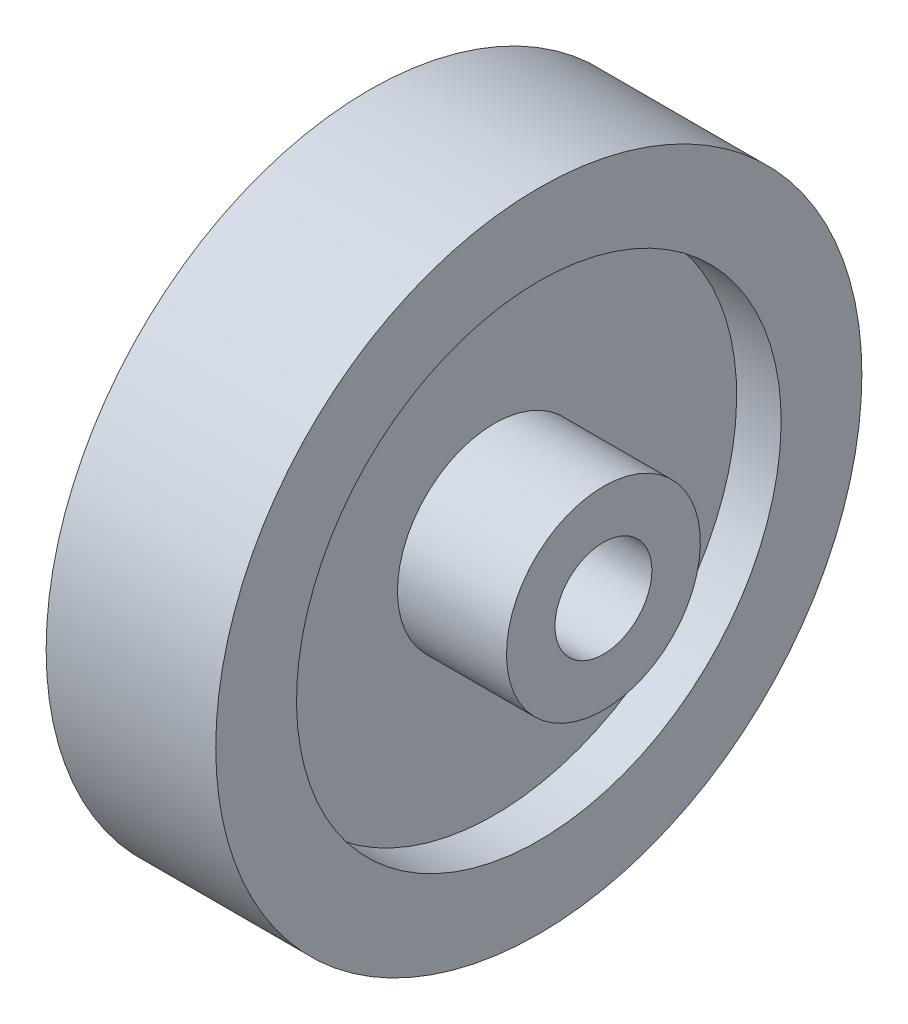
ISO-10303-21;
HEADER;
FILE_DESCRIPTION(('STEP AP214'),'2;1');
FILE_NAME('part.step','',(''),(''),'','','');
FILE_SCHEMA(('AUTOMOTIVE_DESIGN { 1 0 10303 214 1 1 1 1 }'));
ENDSEC;
DATA;
#1=APPLICATION_CONTEXT('core data for automotive mechanical design processes');
#2=APPLICATION_PROTOCOL_DEFINITION('international standard','automotive_design',2000,#1);
#3=PRODUCT_CONTEXT('',#1,'mechanical');
#4=PRODUCT('Part','Part','',(#3));
#5=PRODUCT_RELATED_PRODUCT_CATEGORY('part','',(#4));
#6=PRODUCT_DEFINITION_FORMATION('','',#4);
#7=PRODUCT_DEFINITION_CONTEXT('part definition',#1,'design');
#8=PRODUCT_DEFINITION('design','',#6,#7);
#9=PRODUCT_DEFINITION_SHAPE('','',#8);
#10=(LENGTH_UNIT() NAMED_UNIT(*) SI_UNIT(.MILLI.,.METRE.));
#11=(NAMED_UNIT(*) PLANE_ANGLE_UNIT() SI_UNIT($,.RADIAN.));
#12=(NAMED_UNIT(*) SI_UNIT($,.STERADIAN.) SOLID_ANGLE_UNIT());
#13=UNCERTAINTY_MEASURE_WITH_UNIT(LENGTH_MEASURE(1.E-05),#10,'distance_accuracy_value','');
#14=(GEOMETRIC_REPRESENTATION_CONTEXT(3) GLOBAL_UNCERTAINTY_ASSIGNED_CONTEXT((#13)) GLOBAL_UNIT_ASSIGNED_CONTEXT((#10,
#11,#12)) REPRESENTATION_CONTEXT('',''));
#15=CARTESIAN_POINT('',(0.,0.,0.));
#16=DIRECTION('',(0.,0.,1.));
#17=DIRECTION('',(1.,0.,0.));
#18=AXIS2_PLACEMENT_3D('',#15,#16,#17);
#19=CARTESIAN_POINT('',(0.,0.,0.));
#20=DIRECTION('',(1.,0.,0.));
#21=DIRECTION('',(0.,1.,0.));
#22=AXIS2_PLACEMENT_3D('',#19,#20,#21);
#23=CYLINDRICAL_SURFACE('',#22,12.);
#24=CARTESIAN_POINT('',(5.,0.,0.));
#25=DIRECTION('',(1.,0.,0.));
#26=DIRECTION('',(0.,1.,0.));
#27=AXIS2_PLACEMENT_3D('',#24,#25,#26);
#28=CIRCLE('',#27,12.);
#29=CARTESIAN_POINT('',(5.,12.,0.));
#30=VERTEX_POINT('',#29);
#31=EDGE_CURVE('E10',#30,#30,#28,.T.);
#32=ORIENTED_EDGE('',*,*,#31,.T.);
#33=EDGE_LOOP('',(#32));
#34=FACE_BOUND('',#33,.T.);
#35=CARTESIAN_POINT('',(18.5,0.,0.));
#36=DIRECTION('',(1.,0.,0.));
#37=DIRECTION('',(0.,1.,0.));
#38=AXIS2_PLACEMENT_3D('',#35,#36,#37);
#39=CIRCLE('',#38,12.);
#40=CARTESIAN_POINT('',(18.5,12.,0.));
#41=VERTEX_POINT('',#40);
#42=EDGE_CURVE('E71',#41,#41,#39,.T.);
#43=ORIENTED_EDGE('',*,*,#42,.F.);
#44=EDGE_LOOP('',(#43));
#45=FACE_BOUND('',#44,.T.);
#46=ADVANCED_FACE('F31',(#34,#45),#23,.T.);
#47=CARTESIAN_POINT('',(5.,12.,0.));
#48=DIRECTION('',(1.,0.,0.));
#49=DIRECTION('',(0.,1.,0.));
#50=AXIS2_PLACEMENT_3D('',#47,#48,#49);
#51=PLANE('',#50);
#52=CARTESIAN_POINT('',(5.,0.,0.));
#53=DIRECTION('',(1.,0.,0.));
#54=DIRECTION('',(0.,1.,0.));
#55=AXIS2_PLACEMENT_3D('',#52,#53,#54);
#56=CIRCLE('',#55,30.);
#57=CARTESIAN_POINT('',(5.,30.,0.));
#58=VERTEX_POINT('',#57);
#59=EDGE_CURVE('E37',#58,#58,#56,.T.);
#60=ORIENTED_EDGE('',*,*,#59,.T.);
#61=EDGE_LOOP('',(#60));
#62=FACE_BOUND('',#61,.T.);
#63=ORIENTED_EDGE('',*,*,#31,.F.);
#64=EDGE_LOOP('',(#63));
#65=FACE_BOUND('',#64,.T.);
#66=ADVANCED_FACE('F79',(#62,#65),#51,.T.);
#67=CARTESIAN_POINT('',(0.,0.,0.));
#68=DIRECTION('',(1.,0.,0.));
#69=DIRECTION('',(0.,1.,0.));
#70=AXIS2_PLACEMENT_3D('',#67,#68,#69);
#71=CYLINDRICAL_SURFACE('',#70,30.);
#72=CARTESIAN_POINT('',(10.5,0.,0.));
#73=DIRECTION('',(1.,0.,0.));
#74=DIRECTION('',(0.,1.,0.));
#75=AXIS2_PLACEMENT_3D('',#72,#73,#74);
#76=CIRCLE('',#75,30.);
#77=CARTESIAN_POINT('',(10.5,30.,0.));
#78=VERTEX_POINT('',#77);
#79=EDGE_CURVE('E41',#78,#78,#76,.T.);
#80=ORIENTED_EDGE('',*,*,#79,.T.);
#81=EDGE_LOOP('',(#80));
#82=FACE_BOUND('',#81,.T.);
#83=ORIENTED_EDGE('',*,*,#59,.F.);
#84=EDGE_LOOP('',(#83));
#85=FACE_BOUND('',#84,.T.);
#86=ADVANCED_FACE('F83',(#82,#85),#71,.F.);
#87=CARTESIAN_POINT('',(10.5,30.,0.));
#88=DIRECTION('',(1.,0.,0.));
#89=DIRECTION('',(0.,1.,0.));
#90=AXIS2_PLACEMENT_3D('',#87,#88,#89);
#91=PLANE('',#90);
#92=CARTESIAN_POINT('',(10.5,0.,0.));
#93=DIRECTION('',(1.,0.,0.));
#94=DIRECTION('',(0.,1.,0.));
#95=AXIS2_PLACEMENT_3D('',#92,#93,#94);
#96=CIRCLE('',#95,40.);
#97=CARTESIAN_POINT('',(10.5,40.,0.));
#98=VERTEX_POINT('',#97);
#99=EDGE_CURVE('E45',#98,#98,#96,.T.);
#100=ORIENTED_EDGE('',*,*,#99,.T.);
#101=EDGE_LOOP('',(#100));
#102=FACE_BOUND('',#101,.T.);
#103=ORIENTED_EDGE('',*,*,#79,.F.);
#104=EDGE_LOOP('',(#103));
#105=FACE_BOUND('',#104,.T.);
#106=ADVANCED_FACE('F87',(#102,#105),#91,.T.);
#107=CARTESIAN_POINT('',(0.,0.,0.));
#108=DIRECTION('',(1.,0.,0.));
#109=DIRECTION('',(0.,1.,0.));
#110=AXIS2_PLACEMENT_3D('',#107,#108,#109);
#111=CYLINDRICAL_SURFACE('',#110,40.);
#112=CARTESIAN_POINT('',(-10.5,0.,0.));
#113=DIRECTION('',(1.,0.,0.));
#114=DIRECTION('',(0.,1.,0.));
#115=AXIS2_PLACEMENT_3D('',#112,#113,#114);
#116=CIRCLE('',#115,40.);
#117=CARTESIAN_POINT('',(-10.5,40.,0.));
#118=VERTEX_POINT('',#117);
#119=EDGE_CURVE('E50',#118,#118,#116,.T.);
#120=ORIENTED_EDGE('',*,*,#119,.T.);
#121=EDGE_LOOP('',(#120));
#122=FACE_BOUND('',#121,.T.);
#123=ORIENTED_EDGE('',*,*,#99,.F.);
#124=EDGE_LOOP('',(#123));
#125=FACE_BOUND('',#124,.T.);
#126=ADVANCED_FACE('F94',(#122,#125),#111,.T.);
#127=CARTESIAN_POINT('',(-10.5,30.,0.));
#128=DIRECTION('',(-1.,0.,0.));
#129=DIRECTION('',(0.,-1.,0.));
#130=AXIS2_PLACEMENT_3D('',#127,#128,#129);
#131=PLANE('',#130);
#132=CARTESIAN_POINT('',(-10.5,0.,0.));
#133=DIRECTION('',(1.,0.,0.));
#134=DIRECTION('',(0.,1.,0.));
#135=AXIS2_PLACEMENT_3D('',#132,#133,#134);
#136=CIRCLE('',#135,30.);
#137=CARTESIAN_POINT('',(-10.5,30.,0.));
#138=VERTEX_POINT('',#137);
#139=EDGE_CURVE('E53',#138,#138,#136,.T.);
#140=ORIENTED_EDGE('',*,*,#139,.T.);
#141=EDGE_LOOP('',(#140));
#142=FACE_BOUND('',#141,.T.);
#143=ORIENTED_EDGE('',*,*,#119,.F.);
#144=EDGE_LOOP('',(#143));
#145=FACE_BOUND('',#144,.T.);
#146=ADVANCED_FACE('F98',(#142,#145),#131,.T.);
#147=CARTESIAN_POINT('',(0.,0.,0.));
#148=DIRECTION('',(1.,0.,0.));
#149=DIRECTION('',(0.,1.,0.));
#150=AXIS2_PLACEMENT_3D('',#147,#148,#149);
#151=CYLINDRICAL_SURFACE('',#150,30.);
#152=CARTESIAN_POINT('',(-5.,0.,0.));
#153=DIRECTION('',(1.,0.,0.));
#154=DIRECTION('',(0.,1.,0.));
#155=AXIS2_PLACEMENT_3D('',#152,#153,#154);
#156=CIRCLE('',#155,30.);
#157=CARTESIAN_POINT('',(-5.,30.,0.));
#158=VERTEX_POINT('',#157);
#159=EDGE_CURVE('E56',#158,#158,#156,.T.);
#160=ORIENTED_EDGE('',*,*,#159,.T.);
#161=EDGE_LOOP('',(#160));
#162=FACE_BOUND('',#161,.T.);
#163=ORIENTED_EDGE('',*,*,#139,.F.);
#164=EDGE_LOOP('',(#163));
#165=FACE_BOUND('',#164,.T.);
#166=ADVANCED_FACE('F102',(#162,#165),#151,.F.);
#167=CARTESIAN_POINT('',(-5.,12.,0.));
#168=DIRECTION('',(-1.,0.,0.));
#169=DIRECTION('',(0.,-1.,0.));
#170=AXIS2_PLACEMENT_3D('',#167,#168,#169);
#171=PLANE('',#170);
#172=CARTESIAN_POINT('',(-5.,0.,0.));
#173=DIRECTION('',(1.,0.,0.));
#174=DIRECTION('',(0.,1.,0.));
#175=AXIS2_PLACEMENT_3D('',#172,#173,#174);
#176=CIRCLE('',#175,12.);
#177=CARTESIAN_POINT('',(-5.,12.,0.));
#178=VERTEX_POINT('',#177);
#179=EDGE_CURVE('E59',#178,#178,#176,.T.);
#180=ORIENTED_EDGE('',*,*,#179,.T.);
#181=EDGE_LOOP('',(#180));
#182=FACE_BOUND('',#181,.T.);
#183=ORIENTED_EDGE('',*,*,#159,.F.);
#184=EDGE_LOOP('',(#183));
#185=FACE_BOUND('',#184,.T.);
#186=ADVANCED_FACE('F106',(#182,#185),#171,.T.);
#187=CARTESIAN_POINT('',(0.,0.,0.));
#188=DIRECTION('',(1.,0.,0.));
#189=DIRECTION('',(0.,1.,0.));
#190=AXIS2_PLACEMENT_3D('',#187,#188,#189);
#191=CYLINDRICAL_SURFACE('',#190,12.);
#192=CARTESIAN_POINT('',(-18.5,0.,0.));
#193=DIRECTION('',(1.,0.,0.));
#194=DIRECTION('',(0.,1.,0.));
#195=AXIS2_PLACEMENT_3D('',#192,#193,#194);
#196=CIRCLE('',#195,12.);
#197=CARTESIAN_POINT('',(-18.5,12.,0.));
#198=VERTEX_POINT('',#197);
#199=EDGE_CURVE('E62',#198,#198,#196,.T.);
#200=ORIENTED_EDGE('',*,*,#199,.T.);
#201=EDGE_LOOP('',(#200));
#202=FACE_BOUND('',#201,.T.);
#203=ORIENTED_EDGE('',*,*,#179,.F.);
#204=EDGE_LOOP('',(#203));
#205=FACE_BOUND('',#204,.T.);
#206=ADVANCED_FACE('F110',(#202,#205),#191,.T.);
#207=CARTESIAN_POINT('',(-18.5,6.,0.));
#208=DIRECTION('',(-1.,0.,0.));
#209=DIRECTION('',(0.,-1.,0.));
#210=AXIS2_PLACEMENT_3D('',#207,#208,#209);
#211=PLANE('',#210);
#212=CARTESIAN_POINT('',(-18.5,0.,0.));
#213=DIRECTION('',(1.,0.,0.));
#214=DIRECTION('',(0.,1.,0.));
#215=AXIS2_PLACEMENT_3D('',#212,#213,#214);
#216=CIRCLE('',#215,6.);
#217=CARTESIAN_POINT('',(-18.5,6.,0.));
#218=VERTEX_POINT('',#217);
#219=EDGE_CURVE('E65',#218,#218,#216,.T.);
#220=ORIENTED_EDGE('',*,*,#219,.T.);
#221=EDGE_LOOP('',(#220));
#222=FACE_BOUND('',#221,.T.);
#223=ORIENTED_EDGE('',*,*,#199,.F.);
#224=EDGE_LOOP('',(#223));
#225=FACE_BOUND('',#224,.T.);
#226=ADVANCED_FACE('F114',(#222,#225),#211,.T.);
#227=CARTESIAN_POINT('',(0.,0.,0.));
#228=DIRECTION('',(1.,0.,0.));
#229=DIRECTION('',(0.,1.,0.));
#230=AXIS2_PLACEMENT_3D('',#227,#228,#229);
#231=CYLINDRICAL_SURFACE('',#230,6.);
#232=CARTESIAN_POINT('',(18.5,0.,0.));
#233=DIRECTION('',(1.,0.,0.));
#234=DIRECTION('',(0.,1.,0.));
#235=AXIS2_PLACEMENT_3D('',#232,#233,#234);
#236=CIRCLE('',#235,6.);
#237=CARTESIAN_POINT('',(18.5,6.,0.));
#238=VERTEX_POINT('',#237);
#239=EDGE_CURVE('E68',#238,#238,#236,.T.);
#240=ORIENTED_EDGE('',*,*,#239,.T.);
#241=EDGE_LOOP('',(#240));
#242=FACE_BOUND('',#241,.T.);
#243=ORIENTED_EDGE('',*,*,#219,.F.);
#244=EDGE_LOOP('',(#243));
#245=FACE_BOUND('',#244,.T.);
#246=ADVANCED_FACE('F118',(#242,#245),#231,.F.);
#247=CARTESIAN_POINT('',(18.5,6.,0.));
#248=DIRECTION('',(1.,0.,0.));
#249=DIRECTION('',(0.,1.,0.));
#250=AXIS2_PLACEMENT_3D('',#247,#248,#249);
#251=PLANE('',#250);
#252=ORIENTED_EDGE('',*,*,#42,.T.);
#253=EDGE_LOOP('',(#252));
#254=FACE_BOUND('',#253,.T.);
#255=ORIENTED_EDGE('',*,*,#239,.F.);
#256=EDGE_LOOP('',(#255));
#257=FACE_BOUND('',#256,.T.);
#258=ADVANCED_FACE('F75',(#254,#257),#251,.T.);
#259=CLOSED_SHELL('',(#46,#66,#86,#106,#126,#146,#166,#186,#206,#226,#246,#258));
#260=MANIFOLD_SOLID_BREP('B2',#259);
#261=ADVANCED_BREP_SHAPE_REPRESENTATION('',(#18,#260),#14);
#262=SHAPE_DEFINITION_REPRESENTATION(#9,#261);
ENDSEC;
END-ISO-10303-21;
